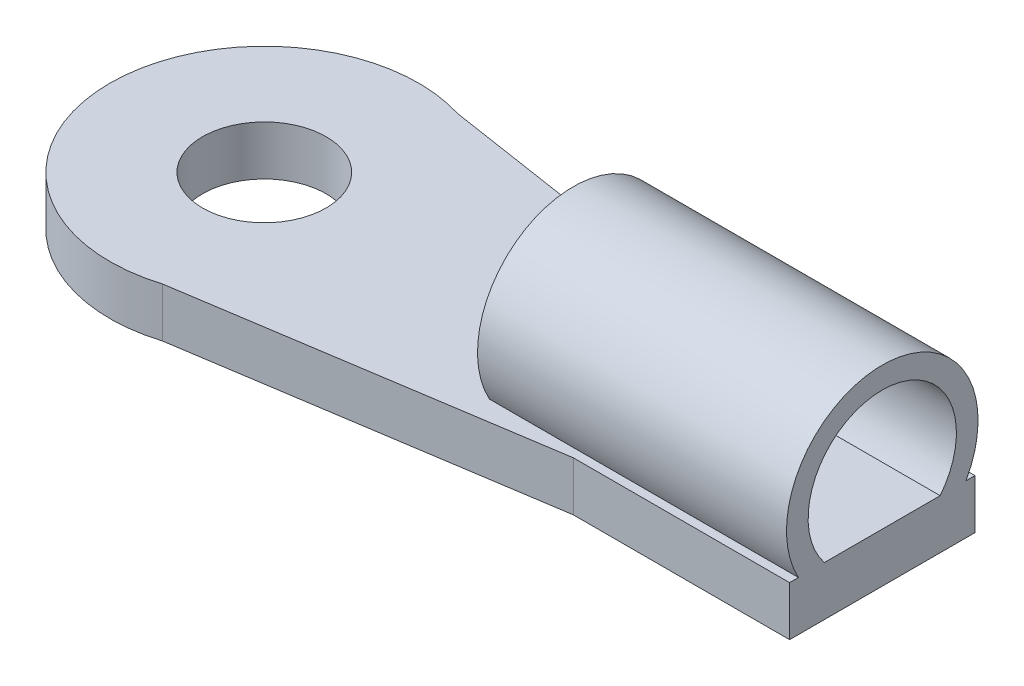
ISO-10303-21;
HEADER;
FILE_DESCRIPTION(('STEP AP214'),'2;1');
FILE_NAME('part.step','',(''),(''),'','','');
FILE_SCHEMA(('AUTOMOTIVE_DESIGN { 1 0 10303 214 1 1 1 1 }'));
ENDSEC;
DATA;
#1=APPLICATION_CONTEXT('core data for automotive mechanical design processes');
#2=APPLICATION_PROTOCOL_DEFINITION('international standard','automotive_design',2000,#1);
#3=PRODUCT_CONTEXT('',#1,'mechanical');
#4=PRODUCT('Part','Part','',(#3));
#5=PRODUCT_RELATED_PRODUCT_CATEGORY('part','',(#4));
#6=PRODUCT_DEFINITION_FORMATION('','',#4);
#7=PRODUCT_DEFINITION_CONTEXT('part definition',#1,'design');
#8=PRODUCT_DEFINITION('design','',#6,#7);
#9=PRODUCT_DEFINITION_SHAPE('','',#8);
#10=(LENGTH_UNIT() NAMED_UNIT(*) SI_UNIT(.MILLI.,.METRE.));
#11=(NAMED_UNIT(*) PLANE_ANGLE_UNIT() SI_UNIT($,.RADIAN.));
#12=(NAMED_UNIT(*) SI_UNIT($,.STERADIAN.) SOLID_ANGLE_UNIT());
#13=UNCERTAINTY_MEASURE_WITH_UNIT(LENGTH_MEASURE(1.E-05),#10,'distance_accuracy_value','');
#14=(GEOMETRIC_REPRESENTATION_CONTEXT(3) GLOBAL_UNCERTAINTY_ASSIGNED_CONTEXT((#13)) GLOBAL_UNIT_ASSIGNED_CONTEXT((#10,
#11,#12)) REPRESENTATION_CONTEXT('',''));
#15=CARTESIAN_POINT('',(0.,0.,0.));
#16=DIRECTION('',(0.,0.,1.));
#17=DIRECTION('',(1.,0.,0.));
#18=AXIS2_PLACEMENT_3D('',#15,#16,#17);
#19=CARTESIAN_POINT('',(0.,0.8,0.));
#20=DIRECTION('',(0.,1.,0.));
#21=DIRECTION('',(0.,0.,1.));
#22=AXIS2_PLACEMENT_3D('',#19,#20,#21);
#23=PLANE('',#22);
#24=CARTESIAN_POINT('',(0.,0.8,0.));
#25=DIRECTION('',(0.,1.,0.));
#26=DIRECTION('',(0.,0.,1.));
#27=AXIS2_PLACEMENT_3D('',#24,#25,#26);
#28=CIRCLE('',#27,1.);
#29=CARTESIAN_POINT('',(0.,0.8,1.));
#30=VERTEX_POINT('',#29);
#31=EDGE_CURVE('E148',#30,#30,#28,.T.);
#32=ORIENTED_EDGE('',*,*,#31,.F.);
#33=EDGE_LOOP('',(#32));
#34=FACE_BOUND('',#33,.T.);
#35=DIRECTION('',(0.,0.,1.));
#36=VECTOR('',#35,1.);
#37=CARTESIAN_POINT('',(5.,0.8,0.));
#38=LINE('',#37,#36);
#39=CARTESIAN_POINT('',(5.,0.8,0.93674969975976));
#40=VERTEX_POINT('',#39);
#41=CARTESIAN_POINT('',(5.,0.8,1.35646599662505));
#42=VERTEX_POINT('',#41);
#43=EDGE_CURVE('E51',#40,#42,#38,.T.);
#44=ORIENTED_EDGE('',*,*,#43,.F.);
#45=DIRECTION('',(1.,0.,0.));
#46=VECTOR('',#45,1.);
#47=CARTESIAN_POINT('',(5.,0.8,0.93674969975976));
#48=LINE('',#47,#46);
#49=CARTESIAN_POINT('',(10.,0.8,0.93674969975976));
#50=VERTEX_POINT('',#49);
#51=EDGE_CURVE('E142',#40,#50,#48,.T.);
#52=ORIENTED_EDGE('',*,*,#51,.T.);
#53=DIRECTION('',(0.,0.,-1.));
#54=VECTOR('',#53,1.);
#55=CARTESIAN_POINT('',(10.,0.8,-1.5));
#56=LINE('',#55,#54);
#57=CARTESIAN_POINT('',(10.,0.8,-0.936749699759759));
#58=VERTEX_POINT('',#57);
#59=EDGE_CURVE('E120',#50,#58,#56,.T.);
#60=ORIENTED_EDGE('',*,*,#59,.T.);
#61=DIRECTION('',(1.,0.,0.));
#62=VECTOR('',#61,1.);
#63=CARTESIAN_POINT('',(5.,0.8,-0.936749699759759));
#64=LINE('',#63,#62);
#65=CARTESIAN_POINT('',(5.,0.8,-0.936749699759759));
#66=VERTEX_POINT('',#65);
#67=EDGE_CURVE('E131',#66,#58,#64,.T.);
#68=ORIENTED_EDGE('',*,*,#67,.F.);
#69=CARTESIAN_POINT('',(5.,0.8,-1.35646599662505));
#70=VERTEX_POINT('',#69);
#71=EDGE_CURVE('E127',#70,#66,#38,.T.);
#72=ORIENTED_EDGE('',*,*,#71,.F.);
#73=DIRECTION('',(1.,0.,0.));
#74=VECTOR('',#73,1.);
#75=CARTESIAN_POINT('',(5.,0.8,-1.35646599662505));
#76=LINE('',#75,#74);
#77=CARTESIAN_POINT('',(10.,0.8,-1.35646599662505));
#78=VERTEX_POINT('',#77);
#79=EDGE_CURVE('E125',#70,#78,#76,.T.);
#80=ORIENTED_EDGE('',*,*,#79,.T.);
#81=CARTESIAN_POINT('',(10.,0.8,-1.5));
#82=VERTEX_POINT('',#81);
#83=EDGE_CURVE('E112',#78,#82,#56,.T.);
#84=ORIENTED_EDGE('',*,*,#83,.T.);
#85=DIRECTION('',(-1.,0.,0.));
#86=VECTOR('',#85,1.);
#87=CARTESIAN_POINT('',(6.5,0.8,-1.5));
#88=LINE('',#87,#86);
#89=CARTESIAN_POINT('',(6.5,0.8,-1.5));
#90=VERTEX_POINT('',#89);
#91=EDGE_CURVE('E157',#82,#90,#88,.T.);
#92=ORIENTED_EDGE('',*,*,#91,.T.);
#93=DIRECTION('',(-0.988319557153298,0.,-0.152395711712331));
#94=VECTOR('',#93,1.);
#95=CARTESIAN_POINT('',(6.5,0.8,-1.5));
#96=LINE('',#95,#94);
#97=CARTESIAN_POINT('',(0.738689026653304,0.8,-2.38837570786131));
#98=VERTEX_POINT('',#97);
#99=EDGE_CURVE('E159',#90,#98,#96,.T.);
#100=ORIENTED_EDGE('',*,*,#99,.T.);
#101=CARTESIAN_POINT('',(0.,0.8,0.));
#102=DIRECTION('',(0.,1.,0.));
#103=DIRECTION('',(0.,0.,1.));
#104=AXIS2_PLACEMENT_3D('',#101,#102,#103);
#105=CIRCLE('',#104,2.5);
#106=CARTESIAN_POINT('',(0.738689026653304,0.8,2.38837570786131));
#107=VERTEX_POINT('',#106);
#108=EDGE_CURVE('E161',#98,#107,#105,.T.);
#109=ORIENTED_EDGE('',*,*,#108,.T.);
#110=DIRECTION('',(0.988319557153298,0.,-0.152395711712331));
#111=VECTOR('',#110,1.);
#112=CARTESIAN_POINT('',(6.5,0.8,1.5));
#113=LINE('',#112,#111);
#114=CARTESIAN_POINT('',(6.5,0.8,1.5));
#115=VERTEX_POINT('',#114);
#116=EDGE_CURVE('E163',#107,#115,#113,.T.);
#117=ORIENTED_EDGE('',*,*,#116,.T.);
#118=DIRECTION('',(1.,0.,0.));
#119=VECTOR('',#118,1.);
#120=CARTESIAN_POINT('',(6.5,0.8,1.5));
#121=LINE('',#120,#119);
#122=CARTESIAN_POINT('',(10.,0.8,1.5));
#123=VERTEX_POINT('',#122);
#124=EDGE_CURVE('E121',#115,#123,#121,.T.);
#125=ORIENTED_EDGE('',*,*,#124,.T.);
#126=CARTESIAN_POINT('',(10.,0.8,1.35646599662505));
#127=VERTEX_POINT('',#126);
#128=EDGE_CURVE('E123',#123,#127,#56,.T.);
#129=ORIENTED_EDGE('',*,*,#128,.T.);
#130=DIRECTION('',(1.,0.,0.));
#131=VECTOR('',#130,1.);
#132=CARTESIAN_POINT('',(5.,0.8,1.35646599662505));
#133=LINE('',#132,#131);
#134=EDGE_CURVE('E56',#42,#127,#133,.T.);
#135=ORIENTED_EDGE('',*,*,#134,.F.);
#136=EDGE_LOOP('',(#44,#52,#60,#68,#72,#80,#84,#92,#100,#109,#117,#125,#129,#135));
#137=FACE_BOUND('',#136,.T.);
#138=ADVANCED_FACE('F36',(#34,#137),#23,.T.);
#139=CARTESIAN_POINT('',(0.,0.,0.));
#140=DIRECTION('',(0.,1.,0.));
#141=DIRECTION('',(0.,0.,1.));
#142=AXIS2_PLACEMENT_3D('',#139,#140,#141);
#143=PLANE('',#142);
#144=DIRECTION('',(1.,0.,0.));
#145=VECTOR('',#144,1.);
#146=CARTESIAN_POINT('',(6.5,0.,1.5));
#147=LINE('',#146,#145);
#148=CARTESIAN_POINT('',(6.5,0.,1.5));
#149=VERTEX_POINT('',#148);
#150=CARTESIAN_POINT('',(10.,0.,1.5));
#151=VERTEX_POINT('',#150);
#152=EDGE_CURVE('E151',#149,#151,#147,.T.);
#153=ORIENTED_EDGE('',*,*,#152,.F.);
#154=DIRECTION('',(0.988319557153298,0.,-0.152395711712331));
#155=VECTOR('',#154,1.);
#156=CARTESIAN_POINT('',(6.5,0.,1.5));
#157=LINE('',#156,#155);
#158=CARTESIAN_POINT('',(0.738689026653304,0.,2.38837570786131));
#159=VERTEX_POINT('',#158);
#160=EDGE_CURVE('E155',#159,#149,#157,.T.);
#161=ORIENTED_EDGE('',*,*,#160,.F.);
#162=CARTESIAN_POINT('',(0.,0.,0.));
#163=DIRECTION('',(0.,1.,0.));
#164=DIRECTION('',(0.,0.,1.));
#165=AXIS2_PLACEMENT_3D('',#162,#163,#164);
#166=CIRCLE('',#165,2.5);
#167=CARTESIAN_POINT('',(0.738689026653304,0.,-2.38837570786131));
#168=VERTEX_POINT('',#167);
#169=EDGE_CURVE('E174',#168,#159,#166,.T.);
#170=ORIENTED_EDGE('',*,*,#169,.F.);
#171=DIRECTION('',(-0.988319557153298,0.,-0.152395711712331));
#172=VECTOR('',#171,1.);
#173=CARTESIAN_POINT('',(6.5,0.,-1.5));
#174=LINE('',#173,#172);
#175=CARTESIAN_POINT('',(6.5,0.,-1.5));
#176=VERTEX_POINT('',#175);
#177=EDGE_CURVE('E172',#176,#168,#174,.T.);
#178=ORIENTED_EDGE('',*,*,#177,.F.);
#179=DIRECTION('',(-1.,0.,0.));
#180=VECTOR('',#179,1.);
#181=CARTESIAN_POINT('',(6.5,0.,-1.5));
#182=LINE('',#181,#180);
#183=CARTESIAN_POINT('',(10.,0.,-1.5));
#184=VERTEX_POINT('',#183);
#185=EDGE_CURVE('E170',#184,#176,#182,.T.);
#186=ORIENTED_EDGE('',*,*,#185,.F.);
#187=DIRECTION('',(0.,0.,-1.));
#188=VECTOR('',#187,1.);
#189=CARTESIAN_POINT('',(10.,0.,-1.5));
#190=LINE('',#189,#188);
#191=EDGE_CURVE('E168',#151,#184,#190,.T.);
#192=ORIENTED_EDGE('',*,*,#191,.F.);
#193=EDGE_LOOP('',(#153,#161,#170,#178,#186,#192));
#194=FACE_BOUND('',#193,.T.);
#195=CARTESIAN_POINT('',(0.,0.,0.));
#196=DIRECTION('',(0.,1.,0.));
#197=DIRECTION('',(0.,0.,1.));
#198=AXIS2_PLACEMENT_3D('',#195,#196,#197);
#199=CIRCLE('',#198,1.);
#200=CARTESIAN_POINT('',(0.,0.,1.));
#201=VERTEX_POINT('',#200);
#202=EDGE_CURVE('E144',#201,#201,#199,.T.);
#203=ORIENTED_EDGE('',*,*,#202,.T.);
#204=EDGE_LOOP('',(#203));
#205=FACE_BOUND('',#204,.T.);
#206=ADVANCED_FACE('F194',(#194,#205),#143,.F.);
#207=CARTESIAN_POINT('',(6.5,0.8,1.5));
#208=DIRECTION('',(0.,0.,-1.));
#209=DIRECTION('',(-1.,0.,0.));
#210=AXIS2_PLACEMENT_3D('',#207,#208,#209);
#211=PLANE('',#210);
#212=ORIENTED_EDGE('',*,*,#152,.T.);
#213=DIRECTION('',(0.,-1.,0.));
#214=VECTOR('',#213,1.);
#215=CARTESIAN_POINT('',(10.,0.8,1.5));
#216=LINE('',#215,#214);
#217=EDGE_CURVE('E11',#123,#151,#216,.T.);
#218=ORIENTED_EDGE('',*,*,#217,.F.);
#219=ORIENTED_EDGE('',*,*,#124,.F.);
#220=DIRECTION('',(0.,-1.,0.));
#221=VECTOR('',#220,1.);
#222=CARTESIAN_POINT('',(6.5,0.8,1.5));
#223=LINE('',#222,#221);
#224=EDGE_CURVE('E165',#115,#149,#223,.T.);
#225=ORIENTED_EDGE('',*,*,#224,.T.);
#226=EDGE_LOOP('',(#212,#218,#219,#225));
#227=FACE_BOUND('',#226,.T.);
#228=ADVANCED_FACE('F38',(#227),#211,.F.);
#229=CARTESIAN_POINT('',(10.,0.8,-1.5));
#230=DIRECTION('',(-1.,0.,0.));
#231=DIRECTION('',(0.,0.,1.));
#232=AXIS2_PLACEMENT_3D('',#229,#230,#231);
#233=PLANE('',#232);
#234=CARTESIAN_POINT('',(10.,1.55,0.));
#235=DIRECTION('',(1.,0.,0.));
#236=DIRECTION('',(0.,0.,-1.));
#237=AXIS2_PLACEMENT_3D('',#234,#235,#236);
#238=CIRCLE('',#237,1.55);
#239=EDGE_CURVE('E117',#78,#127,#238,.T.);
#240=ORIENTED_EDGE('',*,*,#239,.T.);
#241=ORIENTED_EDGE('',*,*,#128,.F.);
#242=ORIENTED_EDGE('',*,*,#217,.T.);
#243=ORIENTED_EDGE('',*,*,#191,.T.);
#244=DIRECTION('',(0.,-1.,0.));
#245=VECTOR('',#244,1.);
#246=CARTESIAN_POINT('',(10.,0.8,-1.5));
#247=LINE('',#246,#245);
#248=EDGE_CURVE('E44',#82,#184,#247,.T.);
#249=ORIENTED_EDGE('',*,*,#248,.F.);
#250=ORIENTED_EDGE('',*,*,#83,.F.);
#251=EDGE_LOOP('',(#240,#241,#242,#243,#249,#250));
#252=FACE_BOUND('',#251,.T.);
#253=ORIENTED_EDGE('',*,*,#59,.F.);
#254=CARTESIAN_POINT('',(10.,1.55,0.));
#255=DIRECTION('',(1.,0.,0.));
#256=DIRECTION('',(0.,0.,-1.));
#257=AXIS2_PLACEMENT_3D('',#254,#255,#256);
#258=CIRCLE('',#257,1.2);
#259=EDGE_CURVE('E135',#58,#50,#258,.T.);
#260=ORIENTED_EDGE('',*,*,#259,.F.);
#261=EDGE_LOOP('',(#253,#260));
#262=FACE_BOUND('',#261,.T.);
#263=ADVANCED_FACE('F114',(#252,#262),#233,.F.);
#264=CARTESIAN_POINT('',(6.5,0.8,-1.5));
#265=DIRECTION('',(0.,0.,1.));
#266=DIRECTION('',(1.,0.,0.));
#267=AXIS2_PLACEMENT_3D('',#264,#265,#266);
#268=PLANE('',#267);
#269=ORIENTED_EDGE('',*,*,#185,.T.);
#270=DIRECTION('',(0.,-1.,0.));
#271=VECTOR('',#270,1.);
#272=CARTESIAN_POINT('',(6.5,0.8,-1.5));
#273=LINE('',#272,#271);
#274=EDGE_CURVE('E185',#90,#176,#273,.T.);
#275=ORIENTED_EDGE('',*,*,#274,.F.);
#276=ORIENTED_EDGE('',*,*,#91,.F.);
#277=ORIENTED_EDGE('',*,*,#248,.T.);
#278=EDGE_LOOP('',(#269,#275,#276,#277));
#279=FACE_BOUND('',#278,.T.);
#280=ADVANCED_FACE('F189',(#279),#268,.F.);
#281=CARTESIAN_POINT('',(6.5,0.8,-1.5));
#282=DIRECTION('',(-0.152395711712331,0.,0.988319557153298));
#283=DIRECTION('',(0.988319557153298,0.,0.152395711712331));
#284=AXIS2_PLACEMENT_3D('',#281,#282,#283);
#285=PLANE('',#284);
#286=ORIENTED_EDGE('',*,*,#177,.T.);
#287=DIRECTION('',(0.,-1.,0.));
#288=VECTOR('',#287,1.);
#289=CARTESIAN_POINT('',(0.738689026653304,0.8,-2.38837570786131));
#290=LINE('',#289,#288);
#291=EDGE_CURVE('E182',#98,#168,#290,.T.);
#292=ORIENTED_EDGE('',*,*,#291,.F.);
#293=ORIENTED_EDGE('',*,*,#99,.F.);
#294=ORIENTED_EDGE('',*,*,#274,.T.);
#295=EDGE_LOOP('',(#286,#292,#293,#294));
#296=FACE_BOUND('',#295,.T.);
#297=ADVANCED_FACE('F200',(#296),#285,.F.);
#298=CARTESIAN_POINT('',(0.,0.8,0.));
#299=DIRECTION('',(0.,-1.,0.));
#300=DIRECTION('',(0.,0.,-1.));
#301=AXIS2_PLACEMENT_3D('',#298,#299,#300);
#302=CYLINDRICAL_SURFACE('',#301,2.5);
#303=ORIENTED_EDGE('',*,*,#169,.T.);
#304=DIRECTION('',(0.,-1.,0.));
#305=VECTOR('',#304,1.);
#306=CARTESIAN_POINT('',(0.738689026653304,0.8,2.38837570786131));
#307=LINE('',#306,#305);
#308=EDGE_CURVE('E179',#107,#159,#307,.T.);
#309=ORIENTED_EDGE('',*,*,#308,.F.);
#310=ORIENTED_EDGE('',*,*,#108,.F.);
#311=ORIENTED_EDGE('',*,*,#291,.T.);
#312=EDGE_LOOP('',(#303,#309,#310,#311));
#313=FACE_BOUND('',#312,.T.);
#314=ADVANCED_FACE('F204',(#313),#302,.T.);
#315=CARTESIAN_POINT('',(6.5,0.8,1.5));
#316=DIRECTION('',(-0.152395711712331,0.,-0.988319557153298));
#317=DIRECTION('',(-0.988319557153298,0.,0.152395711712331));
#318=AXIS2_PLACEMENT_3D('',#315,#316,#317);
#319=PLANE('',#318);
#320=ORIENTED_EDGE('',*,*,#160,.T.);
#321=ORIENTED_EDGE('',*,*,#224,.F.);
#322=ORIENTED_EDGE('',*,*,#116,.F.);
#323=ORIENTED_EDGE('',*,*,#308,.T.);
#324=EDGE_LOOP('',(#320,#321,#322,#323));
#325=FACE_BOUND('',#324,.T.);
#326=ADVANCED_FACE('F211',(#325),#319,.F.);
#327=CARTESIAN_POINT('',(0.,0.8,0.));
#328=DIRECTION('',(0.,-1.,0.));
#329=DIRECTION('',(0.,0.,-1.));
#330=AXIS2_PLACEMENT_3D('',#327,#328,#329);
#331=CYLINDRICAL_SURFACE('',#330,1.);
#332=ORIENTED_EDGE('',*,*,#31,.T.);
#333=EDGE_LOOP('',(#332));
#334=FACE_BOUND('',#333,.T.);
#335=ORIENTED_EDGE('',*,*,#202,.F.);
#336=EDGE_LOOP('',(#335));
#337=FACE_BOUND('',#336,.T.);
#338=ADVANCED_FACE('F226',(#334,#337),#331,.F.);
#339=CARTESIAN_POINT('',(5.,1.55,0.));
#340=DIRECTION('',(1.,0.,0.));
#341=DIRECTION('',(0.,0.,-1.));
#342=AXIS2_PLACEMENT_3D('',#339,#340,#341);
#343=CYLINDRICAL_SURFACE('',#342,1.2);
#344=ORIENTED_EDGE('',*,*,#259,.T.);
#345=ORIENTED_EDGE('',*,*,#51,.F.);
#346=CARTESIAN_POINT('',(5.,1.55,0.));
#347=DIRECTION('',(1.,0.,0.));
#348=DIRECTION('',(0.,0.,-1.));
#349=AXIS2_PLACEMENT_3D('',#346,#347,#348);
#350=CIRCLE('',#349,1.2);
#351=EDGE_CURVE('E134',#66,#40,#350,.T.);
#352=ORIENTED_EDGE('',*,*,#351,.F.);
#353=ORIENTED_EDGE('',*,*,#67,.T.);
#354=EDGE_LOOP('',(#344,#345,#352,#353));
#355=FACE_BOUND('',#354,.T.);
#356=ADVANCED_FACE('F258',(#355),#343,.F.);
#357=CARTESIAN_POINT('',(5.,1.55,0.));
#358=DIRECTION('',(1.,0.,0.));
#359=DIRECTION('',(0.,0.,-1.));
#360=AXIS2_PLACEMENT_3D('',#357,#358,#359);
#361=CYLINDRICAL_SURFACE('',#360,1.55);
#362=ORIENTED_EDGE('',*,*,#239,.F.);
#363=ORIENTED_EDGE('',*,*,#79,.F.);
#364=CARTESIAN_POINT('',(5.,1.55,0.));
#365=DIRECTION('',(1.,0.,0.));
#366=DIRECTION('',(0.,0.,-1.));
#367=AXIS2_PLACEMENT_3D('',#364,#365,#366);
#368=CIRCLE('',#367,1.55);
#369=EDGE_CURVE('E321',#70,#42,#368,.T.);
#370=ORIENTED_EDGE('',*,*,#369,.T.);
#371=ORIENTED_EDGE('',*,*,#134,.T.);
#372=EDGE_LOOP('',(#362,#363,#370,#371));
#373=FACE_BOUND('',#372,.T.);
#374=ADVANCED_FACE('F133',(#373),#361,.T.);
#375=CARTESIAN_POINT('',(5.,0.,0.));
#376=DIRECTION('',(1.,0.,0.));
#377=DIRECTION('',(0.,0.,-1.));
#378=AXIS2_PLACEMENT_3D('',#375,#376,#377);
#379=PLANE('',#378);
#380=ORIENTED_EDGE('',*,*,#351,.T.);
#381=ORIENTED_EDGE('',*,*,#43,.T.);
#382=ORIENTED_EDGE('',*,*,#369,.F.);
#383=ORIENTED_EDGE('',*,*,#71,.T.);
#384=EDGE_LOOP('',(#380,#381,#382,#383));
#385=FACE_BOUND('',#384,.T.);
#386=ADVANCED_FACE('F271',(#385),#379,.F.);
#387=CLOSED_SHELL('',(#138,#206,#228,#263,#280,#297,#314,#326,#338,#356,#374,#386));
#388=MANIFOLD_SOLID_BREP('B2',#387);
#389=ADVANCED_BREP_SHAPE_REPRESENTATION('',(#18,#388),#14);
#390=SHAPE_DEFINITION_REPRESENTATION(#9,#389);
ENDSEC;
END-ISO-10303-21;
